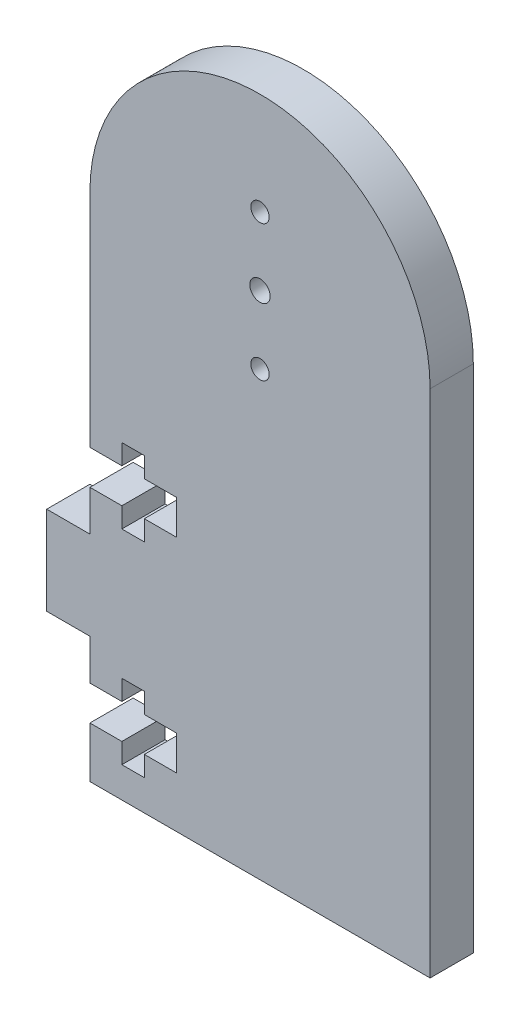
ISO-10303-21;
HEADER;
FILE_DESCRIPTION(('STEP AP214'),'2;1');
FILE_NAME('part.step','',(''),(''),'','','');
FILE_SCHEMA(('AUTOMOTIVE_DESIGN { 1 0 10303 214 1 1 1 1 }'));
ENDSEC;
DATA;
#1=APPLICATION_CONTEXT('core data for automotive mechanical design processes');
#2=APPLICATION_PROTOCOL_DEFINITION('international standard','automotive_design',2000,#1);
#3=PRODUCT_CONTEXT('',#1,'mechanical');
#4=PRODUCT('Part','Part','',(#3));
#5=PRODUCT_RELATED_PRODUCT_CATEGORY('part','',(#4));
#6=PRODUCT_DEFINITION_FORMATION('','',#4);
#7=PRODUCT_DEFINITION_CONTEXT('part definition',#1,'design');
#8=PRODUCT_DEFINITION('design','',#6,#7);
#9=PRODUCT_DEFINITION_SHAPE('','',#8);
#10=(LENGTH_UNIT() NAMED_UNIT(*) SI_UNIT(.MILLI.,.METRE.));
#11=(NAMED_UNIT(*) PLANE_ANGLE_UNIT() SI_UNIT($,.RADIAN.));
#12=(NAMED_UNIT(*) SI_UNIT($,.STERADIAN.) SOLID_ANGLE_UNIT());
#13=UNCERTAINTY_MEASURE_WITH_UNIT(LENGTH_MEASURE(1.E-05),#10,'distance_accuracy_value','');
#14=(GEOMETRIC_REPRESENTATION_CONTEXT(3) GLOBAL_UNCERTAINTY_ASSIGNED_CONTEXT((#13)) GLOBAL_UNIT_ASSIGNED_CONTEXT((#10,
#11,#12)) REPRESENTATION_CONTEXT('',''));
#15=CARTESIAN_POINT('',(0.,0.,0.));
#16=DIRECTION('',(0.,0.,1.));
#17=DIRECTION('',(1.,0.,0.));
#18=AXIS2_PLACEMENT_3D('',#15,#16,#17);
#19=CARTESIAN_POINT('',(-25.,0.,6.35));
#20=DIRECTION('',(1.,0.,0.));
#21=DIRECTION('',(0.,1.,0.));
#22=AXIS2_PLACEMENT_3D('',#19,#20,#21);
#23=PLANE('',#22);
#24=DIRECTION('',(0.,-1.,0.));
#25=VECTOR('',#24,1.);
#26=CARTESIAN_POINT('',(-25.,0.,0.));
#27=LINE('',#26,#25);
#28=CARTESIAN_POINT('',(-25.,-37.54,0.));
#29=VERTEX_POINT('',#28);
#30=CARTESIAN_POINT('',(-25.,-43.5,0.));
#31=VERTEX_POINT('',#30);
#32=EDGE_CURVE('E334',#29,#31,#27,.T.);
#33=ORIENTED_EDGE('',*,*,#32,.T.);
#34=DIRECTION('',(0.,0.,1.));
#35=VECTOR('',#34,1.);
#36=CARTESIAN_POINT('',(-25.,-43.5,0.));
#37=LINE('',#36,#35);
#38=CARTESIAN_POINT('',(-25.,-43.5,6.35));
#39=VERTEX_POINT('',#38);
#40=EDGE_CURVE('E60',#31,#39,#37,.T.);
#41=ORIENTED_EDGE('',*,*,#40,.T.);
#42=DIRECTION('',(0.,-1.,0.));
#43=VECTOR('',#42,1.);
#44=CARTESIAN_POINT('',(-25.,0.,6.35));
#45=LINE('',#44,#43);
#46=CARTESIAN_POINT('',(-25.,-37.54,6.35));
#47=VERTEX_POINT('',#46);
#48=EDGE_CURVE('E302',#47,#39,#45,.T.);
#49=ORIENTED_EDGE('',*,*,#48,.F.);
#50=DIRECTION('',(0.,0.,1.));
#51=VECTOR('',#50,1.);
#52=CARTESIAN_POINT('',(-25.,-37.54,0.));
#53=LINE('',#52,#51);
#54=EDGE_CURVE('E603',#29,#47,#53,.T.);
#55=ORIENTED_EDGE('',*,*,#54,.F.);
#56=EDGE_LOOP('',(#33,#41,#49,#55));
#57=FACE_BOUND('',#56,.T.);
#58=ADVANCED_FACE('F37',(#57),#23,.F.);
#59=CARTESIAN_POINT('',(-25.,-56.5,6.35));
#60=VERTEX_POINT('',#59);
#61=CARTESIAN_POINT('',(-25.,-62.46,6.35));
#62=VERTEX_POINT('',#61);
#63=EDGE_CURVE('E52',#60,#62,#45,.T.);
#64=ORIENTED_EDGE('',*,*,#63,.F.);
#65=DIRECTION('',(0.,0.,1.));
#66=VECTOR('',#65,1.);
#67=CARTESIAN_POINT('',(-25.,-56.5,0.));
#68=LINE('',#67,#66);
#69=CARTESIAN_POINT('',(-25.,-56.5,0.));
#70=VERTEX_POINT('',#69);
#71=EDGE_CURVE('E258',#70,#60,#68,.T.);
#72=ORIENTED_EDGE('',*,*,#71,.F.);
#73=CARTESIAN_POINT('',(-25.,-62.46,0.));
#74=VERTEX_POINT('',#73);
#75=EDGE_CURVE('E270',#70,#74,#27,.T.);
#76=ORIENTED_EDGE('',*,*,#75,.T.);
#77=DIRECTION('',(0.,0.,1.));
#78=VECTOR('',#77,1.);
#79=CARTESIAN_POINT('',(-25.,-62.46,0.));
#80=LINE('',#79,#78);
#81=EDGE_CURVE('E455',#74,#62,#80,.T.);
#82=ORIENTED_EDGE('',*,*,#81,.T.);
#83=EDGE_LOOP('',(#64,#72,#76,#82));
#84=FACE_BOUND('',#83,.T.);
#85=ADVANCED_FACE('F518',(#84),#23,.F.);
#86=CARTESIAN_POINT('',(-25.,-67.54,6.35));
#87=VERTEX_POINT('',#86);
#88=CARTESIAN_POINT('',(-25.,-75.,6.35));
#89=VERTEX_POINT('',#88);
#90=EDGE_CURVE('E303',#87,#89,#45,.T.);
#91=ORIENTED_EDGE('',*,*,#90,.F.);
#92=DIRECTION('',(0.,0.,1.));
#93=VECTOR('',#92,1.);
#94=CARTESIAN_POINT('',(-25.,-67.54,0.));
#95=LINE('',#94,#93);
#96=CARTESIAN_POINT('',(-25.,-67.54,0.));
#97=VERTEX_POINT('',#96);
#98=EDGE_CURVE('E453',#97,#87,#95,.T.);
#99=ORIENTED_EDGE('',*,*,#98,.F.);
#100=CARTESIAN_POINT('',(-25.,-75.,0.));
#101=VERTEX_POINT('',#100);
#102=EDGE_CURVE('E328',#97,#101,#27,.T.);
#103=ORIENTED_EDGE('',*,*,#102,.T.);
#104=DIRECTION('',(0.,0.,-1.));
#105=VECTOR('',#104,1.);
#106=CARTESIAN_POINT('',(-25.,-75.,6.35));
#107=LINE('',#106,#105);
#108=EDGE_CURVE('E45',#89,#101,#107,.T.);
#109=ORIENTED_EDGE('',*,*,#108,.F.);
#110=EDGE_LOOP('',(#91,#99,#103,#109));
#111=FACE_BOUND('',#110,.T.);
#112=ADVANCED_FACE('F523',(#111),#23,.F.);
#113=CARTESIAN_POINT('',(0.,0.,6.35));
#114=DIRECTION('',(0.,0.,-1.));
#115=DIRECTION('',(-1.,0.,0.));
#116=AXIS2_PLACEMENT_3D('',#113,#114,#115);
#117=CYLINDRICAL_SURFACE('',#116,25.);
#118=CARTESIAN_POINT('',(0.,0.,0.));
#119=DIRECTION('',(0.,0.,1.));
#120=DIRECTION('',(1.,0.,0.));
#121=AXIS2_PLACEMENT_3D('',#118,#119,#120);
#122=CIRCLE('',#121,25.);
#123=CARTESIAN_POINT('',(25.,0.,0.));
#124=VERTEX_POINT('',#123);
#125=CARTESIAN_POINT('',(-25.,0.,0.));
#126=VERTEX_POINT('',#125);
#127=EDGE_CURVE('E325',#124,#126,#122,.T.);
#128=ORIENTED_EDGE('',*,*,#127,.T.);
#129=DIRECTION('',(0.,0.,-1.));
#130=VECTOR('',#129,1.);
#131=CARTESIAN_POINT('',(-25.,0.,6.35));
#132=LINE('',#131,#130);
#133=CARTESIAN_POINT('',(-25.,0.,6.35));
#134=VERTEX_POINT('',#133);
#135=EDGE_CURVE('E12',#134,#126,#132,.T.);
#136=ORIENTED_EDGE('',*,*,#135,.F.);
#137=CARTESIAN_POINT('',(0.,0.,6.35));
#138=DIRECTION('',(0.,0.,1.));
#139=DIRECTION('',(1.,0.,0.));
#140=AXIS2_PLACEMENT_3D('',#137,#138,#139);
#141=CIRCLE('',#140,25.);
#142=CARTESIAN_POINT('',(25.,0.,6.35));
#143=VERTEX_POINT('',#142);
#144=EDGE_CURVE('E304',#143,#134,#141,.T.);
#145=ORIENTED_EDGE('',*,*,#144,.F.);
#146=DIRECTION('',(0.,0.,-1.));
#147=VECTOR('',#146,1.);
#148=CARTESIAN_POINT('',(25.,0.,6.35));
#149=LINE('',#148,#147);
#150=EDGE_CURVE('E324',#143,#124,#149,.T.);
#151=ORIENTED_EDGE('',*,*,#150,.T.);
#152=EDGE_LOOP('',(#128,#136,#145,#151));
#153=FACE_BOUND('',#152,.T.);
#154=ADVANCED_FACE('F39',(#153),#117,.T.);
#155=CARTESIAN_POINT('',(-25.,-32.46,0.));
#156=VERTEX_POINT('',#155);
#157=EDGE_CURVE('E330',#126,#156,#27,.T.);
#158=ORIENTED_EDGE('',*,*,#157,.T.);
#159=DIRECTION('',(0.,0.,1.));
#160=VECTOR('',#159,1.);
#161=CARTESIAN_POINT('',(-25.,-32.46,0.));
#162=LINE('',#161,#160);
#163=CARTESIAN_POINT('',(-25.,-32.46,6.35));
#164=VERTEX_POINT('',#163);
#165=EDGE_CURVE('E660',#156,#164,#162,.T.);
#166=ORIENTED_EDGE('',*,*,#165,.T.);
#167=EDGE_CURVE('E295',#134,#164,#45,.T.);
#168=ORIENTED_EDGE('',*,*,#167,.F.);
#169=ORIENTED_EDGE('',*,*,#135,.T.);
#170=EDGE_LOOP('',(#158,#166,#168,#169));
#171=FACE_BOUND('',#170,.T.);
#172=ADVANCED_FACE('F519',(#171),#23,.F.);
#173=CARTESIAN_POINT('',(-25.,-75.,6.35));
#174=DIRECTION('',(0.,1.,0.));
#175=DIRECTION('',(0.,0.,1.));
#176=AXIS2_PLACEMENT_3D('',#173,#174,#175);
#177=PLANE('',#176);
#178=DIRECTION('',(1.,0.,0.));
#179=VECTOR('',#178,1.);
#180=CARTESIAN_POINT('',(-25.,-75.,0.));
#181=LINE('',#180,#179);
#182=CARTESIAN_POINT('',(25.,-75.,0.));
#183=VERTEX_POINT('',#182);
#184=EDGE_CURVE('E333',#101,#183,#181,.T.);
#185=ORIENTED_EDGE('',*,*,#184,.T.);
#186=DIRECTION('',(0.,0.,-1.));
#187=VECTOR('',#186,1.);
#188=CARTESIAN_POINT('',(25.,-75.,6.35));
#189=LINE('',#188,#187);
#190=CARTESIAN_POINT('',(25.,-75.,6.35));
#191=VERTEX_POINT('',#190);
#192=EDGE_CURVE('E340',#191,#183,#189,.T.);
#193=ORIENTED_EDGE('',*,*,#192,.F.);
#194=DIRECTION('',(1.,0.,0.));
#195=VECTOR('',#194,1.);
#196=CARTESIAN_POINT('',(-25.,-75.,6.35));
#197=LINE('',#196,#195);
#198=EDGE_CURVE('E301',#89,#191,#197,.T.);
#199=ORIENTED_EDGE('',*,*,#198,.F.);
#200=ORIENTED_EDGE('',*,*,#108,.T.);
#201=EDGE_LOOP('',(#185,#193,#199,#200));
#202=FACE_BOUND('',#201,.T.);
#203=ADVANCED_FACE('F347',(#202),#177,.F.);
#204=CARTESIAN_POINT('',(25.,0.,6.35));
#205=DIRECTION('',(-1.,0.,0.));
#206=DIRECTION('',(0.,-1.,0.));
#207=AXIS2_PLACEMENT_3D('',#204,#205,#206);
#208=PLANE('',#207);
#209=DIRECTION('',(0.,1.,0.));
#210=VECTOR('',#209,1.);
#211=CARTESIAN_POINT('',(25.,0.,0.));
#212=LINE('',#211,#210);
#213=EDGE_CURVE('E336',#183,#124,#212,.T.);
#214=ORIENTED_EDGE('',*,*,#213,.T.);
#215=ORIENTED_EDGE('',*,*,#150,.F.);
#216=DIRECTION('',(0.,1.,0.));
#217=VECTOR('',#216,1.);
#218=CARTESIAN_POINT('',(25.,0.,6.35));
#219=LINE('',#218,#217);
#220=EDGE_CURVE('E320',#191,#143,#219,.T.);
#221=ORIENTED_EDGE('',*,*,#220,.F.);
#222=ORIENTED_EDGE('',*,*,#192,.T.);
#223=EDGE_LOOP('',(#214,#215,#221,#222));
#224=FACE_BOUND('',#223,.T.);
#225=ADVANCED_FACE('F357',(#224),#208,.F.);
#226=CARTESIAN_POINT('',(0.,0.,6.35));
#227=DIRECTION('',(0.,0.,1.));
#228=DIRECTION('',(1.,0.,0.));
#229=AXIS2_PLACEMENT_3D('',#226,#227,#228);
#230=PLANE('',#229);
#231=DIRECTION('',(1.,0.,0.));
#232=VECTOR('',#231,1.);
#233=CARTESIAN_POINT('',(-20.301,-37.54,6.35));
#234=LINE('',#233,#232);
#235=CARTESIAN_POINT('',(-20.301,-37.54,6.35));
#236=VERTEX_POINT('',#235);
#237=EDGE_CURVE('E378',#47,#236,#234,.T.);
#238=ORIENTED_EDGE('',*,*,#237,.F.);
#239=ORIENTED_EDGE('',*,*,#48,.T.);
#240=DIRECTION('',(-1.,0.,0.));
#241=VECTOR('',#240,1.);
#242=CARTESIAN_POINT('',(-31.35,-43.5,6.35));
#243=LINE('',#242,#241);
#244=CARTESIAN_POINT('',(-31.35,-43.5,6.35));
#245=VERTEX_POINT('',#244);
#246=EDGE_CURVE('E274',#39,#245,#243,.T.);
#247=ORIENTED_EDGE('',*,*,#246,.T.);
#248=DIRECTION('',(0.,-1.,0.));
#249=VECTOR('',#248,1.);
#250=CARTESIAN_POINT('',(-31.35,-43.5,6.35));
#251=LINE('',#250,#249);
#252=CARTESIAN_POINT('',(-31.35,-56.5,6.35));
#253=VERTEX_POINT('',#252);
#254=EDGE_CURVE('E281',#245,#253,#251,.T.);
#255=ORIENTED_EDGE('',*,*,#254,.T.);
#256=DIRECTION('',(1.,0.,0.));
#257=VECTOR('',#256,1.);
#258=CARTESIAN_POINT('',(-31.35,-56.5,6.35));
#259=LINE('',#258,#257);
#260=EDGE_CURVE('E253',#253,#60,#259,.T.);
#261=ORIENTED_EDGE('',*,*,#260,.T.);
#262=ORIENTED_EDGE('',*,*,#63,.T.);
#263=DIRECTION('',(-1.,0.,0.));
#264=VECTOR('',#263,1.);
#265=CARTESIAN_POINT('',(-20.301,-62.46,6.35));
#266=LINE('',#265,#264);
#267=CARTESIAN_POINT('',(-20.301,-62.46,6.35));
#268=VERTEX_POINT('',#267);
#269=EDGE_CURVE('E388',#268,#62,#266,.T.);
#270=ORIENTED_EDGE('',*,*,#269,.F.);
#271=DIRECTION('',(0.,-1.,0.));
#272=VECTOR('',#271,1.);
#273=CARTESIAN_POINT('',(-20.301,-62.46,6.35));
#274=LINE('',#273,#272);
#275=CARTESIAN_POINT('',(-20.301,-59.5009,6.35));
#276=VERTEX_POINT('',#275);
#277=EDGE_CURVE('E391',#276,#268,#274,.T.);
#278=ORIENTED_EDGE('',*,*,#277,.F.);
#279=DIRECTION('',(-1.,0.,0.));
#280=VECTOR('',#279,1.);
#281=CARTESIAN_POINT('',(-20.301,-59.5009,6.35));
#282=LINE('',#281,#280);
#283=CARTESIAN_POINT('',(-16.999,-59.5009,6.35));
#284=VERTEX_POINT('',#283);
#285=EDGE_CURVE('E394',#284,#276,#282,.T.);
#286=ORIENTED_EDGE('',*,*,#285,.F.);
#287=DIRECTION('',(0.,1.,0.));
#288=VECTOR('',#287,1.);
#289=CARTESIAN_POINT('',(-16.999,-62.46,6.35));
#290=LINE('',#289,#288);
#291=CARTESIAN_POINT('',(-16.999,-62.46,6.35));
#292=VERTEX_POINT('',#291);
#293=EDGE_CURVE('E398',#292,#284,#290,.T.);
#294=ORIENTED_EDGE('',*,*,#293,.F.);
#295=DIRECTION('',(-1.,0.,0.));
#296=VECTOR('',#295,1.);
#297=CARTESIAN_POINT('',(-12.3,-62.46,6.35));
#298=LINE('',#297,#296);
#299=CARTESIAN_POINT('',(-12.3,-62.46,6.35));
#300=VERTEX_POINT('',#299);
#301=EDGE_CURVE('E402',#300,#292,#298,.T.);
#302=ORIENTED_EDGE('',*,*,#301,.F.);
#303=DIRECTION('',(0.,1.,0.));
#304=VECTOR('',#303,1.);
#305=CARTESIAN_POINT('',(-12.3,-62.46,6.35));
#306=LINE('',#305,#304);
#307=CARTESIAN_POINT('',(-12.3,-67.54,6.35));
#308=VERTEX_POINT('',#307);
#309=EDGE_CURVE('E406',#308,#300,#306,.T.);
#310=ORIENTED_EDGE('',*,*,#309,.F.);
#311=DIRECTION('',(1.,0.,0.));
#312=VECTOR('',#311,1.);
#313=CARTESIAN_POINT('',(-12.3,-67.54,6.35));
#314=LINE('',#313,#312);
#315=CARTESIAN_POINT('',(-16.999,-67.54,6.35));
#316=VERTEX_POINT('',#315);
#317=EDGE_CURVE('E412',#316,#308,#314,.T.);
#318=ORIENTED_EDGE('',*,*,#317,.F.);
#319=DIRECTION('',(0.,1.,0.));
#320=VECTOR('',#319,1.);
#321=CARTESIAN_POINT('',(-16.999,-70.4991,6.35));
#322=LINE('',#321,#320);
#323=CARTESIAN_POINT('',(-16.999,-70.4991,6.35));
#324=VERTEX_POINT('',#323);
#325=EDGE_CURVE('E416',#324,#316,#322,.T.);
#326=ORIENTED_EDGE('',*,*,#325,.F.);
#327=DIRECTION('',(1.,0.,0.));
#328=VECTOR('',#327,1.);
#329=CARTESIAN_POINT('',(-20.301,-70.4991,6.35));
#330=LINE('',#329,#328);
#331=CARTESIAN_POINT('',(-20.301,-70.4991,6.35));
#332=VERTEX_POINT('',#331);
#333=EDGE_CURVE('E420',#332,#324,#330,.T.);
#334=ORIENTED_EDGE('',*,*,#333,.F.);
#335=DIRECTION('',(0.,-1.,0.));
#336=VECTOR('',#335,1.);
#337=CARTESIAN_POINT('',(-20.301,-70.4991,6.35));
#338=LINE('',#337,#336);
#339=CARTESIAN_POINT('',(-20.301,-67.54,6.35));
#340=VERTEX_POINT('',#339);
#341=EDGE_CURVE('E424',#340,#332,#338,.T.);
#342=ORIENTED_EDGE('',*,*,#341,.F.);
#343=DIRECTION('',(1.,0.,0.));
#344=VECTOR('',#343,1.);
#345=CARTESIAN_POINT('',(-20.301,-67.54,6.35));
#346=LINE('',#345,#344);
#347=EDGE_CURVE('E390',#87,#340,#346,.T.);
#348=ORIENTED_EDGE('',*,*,#347,.F.);
#349=ORIENTED_EDGE('',*,*,#90,.T.);
#350=ORIENTED_EDGE('',*,*,#198,.T.);
#351=ORIENTED_EDGE('',*,*,#220,.T.);
#352=ORIENTED_EDGE('',*,*,#144,.T.);
#353=ORIENTED_EDGE('',*,*,#167,.T.);
#354=DIRECTION('',(-1.,0.,0.));
#355=VECTOR('',#354,1.);
#356=CARTESIAN_POINT('',(-20.301,-32.46,6.35));
#357=LINE('',#356,#355);
#358=CARTESIAN_POINT('',(-20.301,-32.46,6.35));
#359=VERTEX_POINT('',#358);
#360=EDGE_CURVE('E705',#359,#164,#357,.T.);
#361=ORIENTED_EDGE('',*,*,#360,.F.);
#362=DIRECTION('',(0.,-1.,0.));
#363=VECTOR('',#362,1.);
#364=CARTESIAN_POINT('',(-20.301,-32.46,6.35));
#365=LINE('',#364,#363);
#366=CARTESIAN_POINT('',(-20.301,-29.5009,6.35));
#367=VERTEX_POINT('',#366);
#368=EDGE_CURVE('E693',#367,#359,#365,.T.);
#369=ORIENTED_EDGE('',*,*,#368,.F.);
#370=DIRECTION('',(-1.,0.,0.));
#371=VECTOR('',#370,1.);
#372=CARTESIAN_POINT('',(-20.301,-29.5009,6.35));
#373=LINE('',#372,#371);
#374=CARTESIAN_POINT('',(-16.999,-29.5009,6.35));
#375=VERTEX_POINT('',#374);
#376=EDGE_CURVE('E690',#375,#367,#373,.T.);
#377=ORIENTED_EDGE('',*,*,#376,.F.);
#378=DIRECTION('',(0.,1.,0.));
#379=VECTOR('',#378,1.);
#380=CARTESIAN_POINT('',(-16.999,-32.46,6.35));
#381=LINE('',#380,#379);
#382=CARTESIAN_POINT('',(-16.999,-32.46,6.35));
#383=VERTEX_POINT('',#382);
#384=EDGE_CURVE('E687',#383,#375,#381,.T.);
#385=ORIENTED_EDGE('',*,*,#384,.F.);
#386=DIRECTION('',(-1.,0.,0.));
#387=VECTOR('',#386,1.);
#388=CARTESIAN_POINT('',(-12.3,-32.46,6.35));
#389=LINE('',#388,#387);
#390=CARTESIAN_POINT('',(-12.3,-32.46,6.35));
#391=VERTEX_POINT('',#390);
#392=EDGE_CURVE('E631',#391,#383,#389,.T.);
#393=ORIENTED_EDGE('',*,*,#392,.F.);
#394=DIRECTION('',(0.,1.,0.));
#395=VECTOR('',#394,1.);
#396=CARTESIAN_POINT('',(-12.3,-32.46,6.35));
#397=LINE('',#396,#395);
#398=CARTESIAN_POINT('',(-12.3,-37.54,6.35));
#399=VERTEX_POINT('',#398);
#400=EDGE_CURVE('E382',#399,#391,#397,.T.);
#401=ORIENTED_EDGE('',*,*,#400,.F.);
#402=DIRECTION('',(1.,0.,0.));
#403=VECTOR('',#402,1.);
#404=CARTESIAN_POINT('',(-12.3,-37.54,6.35));
#405=LINE('',#404,#403);
#406=CARTESIAN_POINT('',(-16.999,-37.54,6.35));
#407=VERTEX_POINT('',#406);
#408=EDGE_CURVE('E641',#407,#399,#405,.T.);
#409=ORIENTED_EDGE('',*,*,#408,.F.);
#410=DIRECTION('',(0.,1.,0.));
#411=VECTOR('',#410,1.);
#412=CARTESIAN_POINT('',(-16.999,-40.4991,6.35));
#413=LINE('',#412,#411);
#414=CARTESIAN_POINT('',(-16.999,-40.4991,6.35));
#415=VERTEX_POINT('',#414);
#416=EDGE_CURVE('E647',#415,#407,#413,.T.);
#417=ORIENTED_EDGE('',*,*,#416,.F.);
#418=DIRECTION('',(1.,0.,0.));
#419=VECTOR('',#418,1.);
#420=CARTESIAN_POINT('',(-20.301,-40.4991,6.35));
#421=LINE('',#420,#419);
#422=CARTESIAN_POINT('',(-20.301,-40.4991,6.35));
#423=VERTEX_POINT('',#422);
#424=EDGE_CURVE('E714',#423,#415,#421,.T.);
#425=ORIENTED_EDGE('',*,*,#424,.F.);
#426=DIRECTION('',(0.,-1.,0.));
#427=VECTOR('',#426,1.);
#428=CARTESIAN_POINT('',(-20.301,-40.4991,6.35));
#429=LINE('',#428,#427);
#430=EDGE_CURVE('E710',#236,#423,#429,.T.);
#431=ORIENTED_EDGE('',*,*,#430,.F.);
#432=EDGE_LOOP('',(#238,#239,#247,#255,#261,#262,#270,#278,#286,#294,#302,#310,#318,#326,#334,
#342,#348,#349,#350,#351,#352,#353,#361,#369,#377,#385,#393,#401,#409,#417,#425,#431));
#433=FACE_BOUND('',#432,.T.);
#434=CARTESIAN_POINT('',(0.,-10.,6.35));
#435=DIRECTION('',(0.,0.,1.));
#436=DIRECTION('',(1.,0.,0.));
#437=AXIS2_PLACEMENT_3D('',#434,#435,#436);
#438=CIRCLE('',#437,1.35);
#439=CARTESIAN_POINT('',(1.35,-10.,6.35));
#440=VERTEX_POINT('',#439);
#441=EDGE_CURVE('E444',#440,#440,#438,.T.);
#442=ORIENTED_EDGE('',*,*,#441,.F.);
#443=EDGE_LOOP('',(#442));
#444=FACE_BOUND('',#443,.T.);
#445=CARTESIAN_POINT('',(0.,10.,6.35));
#446=DIRECTION('',(0.,0.,1.));
#447=DIRECTION('',(1.,0.,0.));
#448=AXIS2_PLACEMENT_3D('',#445,#446,#447);
#449=CIRCLE('',#448,1.35);
#450=CARTESIAN_POINT('',(1.35,10.,6.35));
#451=VERTEX_POINT('',#450);
#452=EDGE_CURVE('E471',#451,#451,#449,.T.);
#453=ORIENTED_EDGE('',*,*,#452,.F.);
#454=EDGE_LOOP('',(#453));
#455=FACE_BOUND('',#454,.T.);
#456=CARTESIAN_POINT('',(0.,0.,6.35));
#457=DIRECTION('',(0.,0.,1.));
#458=DIRECTION('',(1.,0.,0.));
#459=AXIS2_PLACEMENT_3D('',#456,#457,#458);
#460=CIRCLE('',#459,1.5);
#461=CARTESIAN_POINT('',(1.5,0.,6.35));
#462=VERTEX_POINT('',#461);
#463=EDGE_CURVE('E487',#462,#462,#460,.T.);
#464=ORIENTED_EDGE('',*,*,#463,.F.);
#465=EDGE_LOOP('',(#464));
#466=FACE_BOUND('',#465,.T.);
#467=ADVANCED_FACE('F374',(#433,#444,#455,#466),#230,.T.);
#468=CARTESIAN_POINT('',(0.,0.,0.));
#469=DIRECTION('',(0.,0.,1.));
#470=DIRECTION('',(1.,0.,0.));
#471=AXIS2_PLACEMENT_3D('',#468,#469,#470);
#472=PLANE('',#471);
#473=ORIENTED_EDGE('',*,*,#32,.F.);
#474=DIRECTION('',(1.,0.,0.));
#475=VECTOR('',#474,1.);
#476=CARTESIAN_POINT('',(-20.301,-37.54,0.));
#477=LINE('',#476,#475);
#478=CARTESIAN_POINT('',(-20.301,-37.54,0.));
#479=VERTEX_POINT('',#478);
#480=EDGE_CURVE('E606',#29,#479,#477,.T.);
#481=ORIENTED_EDGE('',*,*,#480,.T.);
#482=DIRECTION('',(0.,-1.,0.));
#483=VECTOR('',#482,1.);
#484=CARTESIAN_POINT('',(-20.301,-40.4991,0.));
#485=LINE('',#484,#483);
#486=CARTESIAN_POINT('',(-20.301,-40.4991,0.));
#487=VERTEX_POINT('',#486);
#488=EDGE_CURVE('E609',#479,#487,#485,.T.);
#489=ORIENTED_EDGE('',*,*,#488,.T.);
#490=DIRECTION('',(1.,0.,0.));
#491=VECTOR('',#490,1.);
#492=CARTESIAN_POINT('',(-20.301,-40.4991,0.));
#493=LINE('',#492,#491);
#494=CARTESIAN_POINT('',(-16.999,-40.4991,0.));
#495=VERTEX_POINT('',#494);
#496=EDGE_CURVE('E613',#487,#495,#493,.T.);
#497=ORIENTED_EDGE('',*,*,#496,.T.);
#498=DIRECTION('',(0.,1.,0.));
#499=VECTOR('',#498,1.);
#500=CARTESIAN_POINT('',(-16.999,-40.4991,0.));
#501=LINE('',#500,#499);
#502=CARTESIAN_POINT('',(-16.999,-37.54,0.));
#503=VERTEX_POINT('',#502);
#504=EDGE_CURVE('E621',#495,#503,#501,.T.);
#505=ORIENTED_EDGE('',*,*,#504,.T.);
#506=DIRECTION('',(1.,0.,0.));
#507=VECTOR('',#506,1.);
#508=CARTESIAN_POINT('',(-12.3,-37.54,0.));
#509=LINE('',#508,#507);
#510=CARTESIAN_POINT('',(-12.3,-37.54,0.));
#511=VERTEX_POINT('',#510);
#512=EDGE_CURVE('E624',#503,#511,#509,.T.);
#513=ORIENTED_EDGE('',*,*,#512,.T.);
#514=DIRECTION('',(0.,1.,0.));
#515=VECTOR('',#514,1.);
#516=CARTESIAN_POINT('',(-12.3,-32.46,0.));
#517=LINE('',#516,#515);
#518=CARTESIAN_POINT('',(-12.3,-32.46,0.));
#519=VERTEX_POINT('',#518);
#520=EDGE_CURVE('E646',#511,#519,#517,.T.);
#521=ORIENTED_EDGE('',*,*,#520,.T.);
#522=DIRECTION('',(-1.,0.,0.));
#523=VECTOR('',#522,1.);
#524=CARTESIAN_POINT('',(-12.3,-32.46,0.));
#525=LINE('',#524,#523);
#526=CARTESIAN_POINT('',(-16.999,-32.46,0.));
#527=VERTEX_POINT('',#526);
#528=EDGE_CURVE('E679',#519,#527,#525,.T.);
#529=ORIENTED_EDGE('',*,*,#528,.T.);
#530=DIRECTION('',(0.,1.,0.));
#531=VECTOR('',#530,1.);
#532=CARTESIAN_POINT('',(-16.999,-32.46,0.));
#533=LINE('',#532,#531);
#534=CARTESIAN_POINT('',(-16.999,-29.5009,0.));
#535=VERTEX_POINT('',#534);
#536=EDGE_CURVE('E1040',#527,#535,#533,.T.);
#537=ORIENTED_EDGE('',*,*,#536,.T.);
#538=DIRECTION('',(-1.,0.,0.));
#539=VECTOR('',#538,1.);
#540=CARTESIAN_POINT('',(-20.301,-29.5009,0.));
#541=LINE('',#540,#539);
#542=CARTESIAN_POINT('',(-20.301,-29.5009,0.));
#543=VERTEX_POINT('',#542);
#544=EDGE_CURVE('E1038',#535,#543,#541,.T.);
#545=ORIENTED_EDGE('',*,*,#544,.T.);
#546=DIRECTION('',(0.,-1.,0.));
#547=VECTOR('',#546,1.);
#548=CARTESIAN_POINT('',(-20.301,-32.46,0.));
#549=LINE('',#548,#547);
#550=CARTESIAN_POINT('',(-20.301,-32.46,0.));
#551=VERTEX_POINT('',#550);
#552=EDGE_CURVE('E616',#543,#551,#549,.T.);
#553=ORIENTED_EDGE('',*,*,#552,.T.);
#554=DIRECTION('',(-1.,0.,0.));
#555=VECTOR('',#554,1.);
#556=CARTESIAN_POINT('',(-20.301,-32.46,0.));
#557=LINE('',#556,#555);
#558=EDGE_CURVE('E611',#551,#156,#557,.T.);
#559=ORIENTED_EDGE('',*,*,#558,.T.);
#560=ORIENTED_EDGE('',*,*,#157,.F.);
#561=ORIENTED_EDGE('',*,*,#127,.F.);
#562=ORIENTED_EDGE('',*,*,#213,.F.);
#563=ORIENTED_EDGE('',*,*,#184,.F.);
#564=ORIENTED_EDGE('',*,*,#102,.F.);
#565=DIRECTION('',(1.,0.,0.));
#566=VECTOR('',#565,1.);
#567=CARTESIAN_POINT('',(-20.301,-67.54,0.));
#568=LINE('',#567,#566);
#569=CARTESIAN_POINT('',(-20.301,-67.54,0.));
#570=VERTEX_POINT('',#569);
#571=EDGE_CURVE('E538',#97,#570,#568,.T.);
#572=ORIENTED_EDGE('',*,*,#571,.T.);
#573=DIRECTION('',(0.,-1.,0.));
#574=VECTOR('',#573,1.);
#575=CARTESIAN_POINT('',(-20.301,-70.4991,0.));
#576=LINE('',#575,#574);
#577=CARTESIAN_POINT('',(-20.301,-70.4991,0.));
#578=VERTEX_POINT('',#577);
#579=EDGE_CURVE('E546',#570,#578,#576,.T.);
#580=ORIENTED_EDGE('',*,*,#579,.T.);
#581=DIRECTION('',(1.,0.,0.));
#582=VECTOR('',#581,1.);
#583=CARTESIAN_POINT('',(-20.301,-70.4991,0.));
#584=LINE('',#583,#582);
#585=CARTESIAN_POINT('',(-16.999,-70.4991,0.));
#586=VERTEX_POINT('',#585);
#587=EDGE_CURVE('E548',#578,#586,#584,.T.);
#588=ORIENTED_EDGE('',*,*,#587,.T.);
#589=DIRECTION('',(0.,1.,0.));
#590=VECTOR('',#589,1.);
#591=CARTESIAN_POINT('',(-16.999,-70.4991,0.));
#592=LINE('',#591,#590);
#593=CARTESIAN_POINT('',(-16.999,-67.54,0.));
#594=VERTEX_POINT('',#593);
#595=EDGE_CURVE('E557',#586,#594,#592,.T.);
#596=ORIENTED_EDGE('',*,*,#595,.T.);
#597=DIRECTION('',(1.,0.,0.));
#598=VECTOR('',#597,1.);
#599=CARTESIAN_POINT('',(-12.3,-67.54,0.));
#600=LINE('',#599,#598);
#601=CARTESIAN_POINT('',(-12.3,-67.54,0.));
#602=VERTEX_POINT('',#601);
#603=EDGE_CURVE('E467',#594,#602,#600,.T.);
#604=ORIENTED_EDGE('',*,*,#603,.T.);
#605=DIRECTION('',(0.,1.,0.));
#606=VECTOR('',#605,1.);
#607=CARTESIAN_POINT('',(-12.3,-62.46,0.));
#608=LINE('',#607,#606);
#609=CARTESIAN_POINT('',(-12.3,-62.46,0.));
#610=VERTEX_POINT('',#609);
#611=EDGE_CURVE('E415',#602,#610,#608,.T.);
#612=ORIENTED_EDGE('',*,*,#611,.T.);
#613=DIRECTION('',(-1.,0.,0.));
#614=VECTOR('',#613,1.);
#615=CARTESIAN_POINT('',(-12.3,-62.46,0.));
#616=LINE('',#615,#614);
#617=CARTESIAN_POINT('',(-16.999,-62.46,0.));
#618=VERTEX_POINT('',#617);
#619=EDGE_CURVE('E581',#610,#618,#616,.T.);
#620=ORIENTED_EDGE('',*,*,#619,.T.);
#621=DIRECTION('',(0.,1.,0.));
#622=VECTOR('',#621,1.);
#623=CARTESIAN_POINT('',(-16.999,-62.46,0.));
#624=LINE('',#623,#622);
#625=CARTESIAN_POINT('',(-16.999,-59.5009,0.));
#626=VERTEX_POINT('',#625);
#627=EDGE_CURVE('E583',#618,#626,#624,.T.);
#628=ORIENTED_EDGE('',*,*,#627,.T.);
#629=DIRECTION('',(-1.,0.,0.));
#630=VECTOR('',#629,1.);
#631=CARTESIAN_POINT('',(-20.301,-59.5009,0.));
#632=LINE('',#631,#630);
#633=CARTESIAN_POINT('',(-20.301,-59.5009,0.));
#634=VERTEX_POINT('',#633);
#635=EDGE_CURVE('E591',#626,#634,#632,.T.);
#636=ORIENTED_EDGE('',*,*,#635,.T.);
#637=DIRECTION('',(0.,-1.,0.));
#638=VECTOR('',#637,1.);
#639=CARTESIAN_POINT('',(-20.301,-62.46,0.));
#640=LINE('',#639,#638);
#641=CARTESIAN_POINT('',(-20.301,-62.46,0.));
#642=VERTEX_POINT('',#641);
#643=EDGE_CURVE('E552',#634,#642,#640,.T.);
#644=ORIENTED_EDGE('',*,*,#643,.T.);
#645=DIRECTION('',(-1.,0.,0.));
#646=VECTOR('',#645,1.);
#647=CARTESIAN_POINT('',(-20.301,-62.46,0.));
#648=LINE('',#647,#646);
#649=EDGE_CURVE('E550',#642,#74,#648,.T.);
#650=ORIENTED_EDGE('',*,*,#649,.T.);
#651=ORIENTED_EDGE('',*,*,#75,.F.);
#652=DIRECTION('',(1.,0.,0.));
#653=VECTOR('',#652,1.);
#654=CARTESIAN_POINT('',(-31.35,-56.5,0.));
#655=LINE('',#654,#653);
#656=CARTESIAN_POINT('',(-31.35,-56.5,0.));
#657=VERTEX_POINT('',#656);
#658=EDGE_CURVE('E251',#657,#70,#655,.T.);
#659=ORIENTED_EDGE('',*,*,#658,.F.);
#660=DIRECTION('',(0.,-1.,0.));
#661=VECTOR('',#660,1.);
#662=CARTESIAN_POINT('',(-31.35,-43.5,0.));
#663=LINE('',#662,#661);
#664=CARTESIAN_POINT('',(-31.35,-43.5,0.));
#665=VERTEX_POINT('',#664);
#666=EDGE_CURVE('E267',#665,#657,#663,.T.);
#667=ORIENTED_EDGE('',*,*,#666,.F.);
#668=DIRECTION('',(-1.,0.,0.));
#669=VECTOR('',#668,1.);
#670=CARTESIAN_POINT('',(-31.35,-43.5,0.));
#671=LINE('',#670,#669);
#672=EDGE_CURVE('E259',#31,#665,#671,.T.);
#673=ORIENTED_EDGE('',*,*,#672,.F.);
#674=EDGE_LOOP('',(#473,#481,#489,#497,#505,#513,#521,#529,#537,#545,#553,#559,#560,#561,#562,
#563,#564,#572,#580,#588,#596,#604,#612,#620,#628,#636,#644,#650,#651,#659,#667,#673));
#675=FACE_BOUND('',#674,.T.);
#676=CARTESIAN_POINT('',(0.,-10.,0.));
#677=DIRECTION('',(0.,0.,1.));
#678=DIRECTION('',(1.,0.,0.));
#679=AXIS2_PLACEMENT_3D('',#676,#677,#678);
#680=CIRCLE('',#679,1.35);
#681=CARTESIAN_POINT('',(1.35,-10.,0.));
#682=VERTEX_POINT('',#681);
#683=EDGE_CURVE('E468',#682,#682,#680,.T.);
#684=ORIENTED_EDGE('',*,*,#683,.T.);
#685=EDGE_LOOP('',(#684));
#686=FACE_BOUND('',#685,.T.);
#687=CARTESIAN_POINT('',(0.,10.,0.));
#688=DIRECTION('',(0.,0.,1.));
#689=DIRECTION('',(1.,0.,0.));
#690=AXIS2_PLACEMENT_3D('',#687,#688,#689);
#691=CIRCLE('',#690,1.35);
#692=CARTESIAN_POINT('',(1.35,10.,0.));
#693=VERTEX_POINT('',#692);
#694=EDGE_CURVE('E476',#693,#693,#691,.T.);
#695=ORIENTED_EDGE('',*,*,#694,.T.);
#696=EDGE_LOOP('',(#695));
#697=FACE_BOUND('',#696,.T.);
#698=CARTESIAN_POINT('',(0.,0.,0.));
#699=DIRECTION('',(0.,0.,1.));
#700=DIRECTION('',(1.,0.,0.));
#701=AXIS2_PLACEMENT_3D('',#698,#699,#700);
#702=CIRCLE('',#701,1.5);
#703=CARTESIAN_POINT('',(1.5,0.,0.));
#704=VERTEX_POINT('',#703);
#705=EDGE_CURVE('E329',#704,#704,#702,.T.);
#706=ORIENTED_EDGE('',*,*,#705,.T.);
#707=EDGE_LOOP('',(#706));
#708=FACE_BOUND('',#707,.T.);
#709=ADVANCED_FACE('F264',(#675,#686,#697,#708),#472,.F.);
#710=CARTESIAN_POINT('',(0.,0.,0.));
#711=DIRECTION('',(0.,0.,1.));
#712=DIRECTION('',(1.,0.,0.));
#713=AXIS2_PLACEMENT_3D('',#710,#711,#712);
#714=CYLINDRICAL_SURFACE('',#713,1.5);
#715=ORIENTED_EDGE('',*,*,#705,.F.);
#716=EDGE_LOOP('',(#715));
#717=FACE_BOUND('',#716,.T.);
#718=ORIENTED_EDGE('',*,*,#463,.T.);
#719=EDGE_LOOP('',(#718));
#720=FACE_BOUND('',#719,.T.);
#721=ADVANCED_FACE('F502',(#717,#720),#714,.F.);
#722=CARTESIAN_POINT('',(0.,10.,0.));
#723=DIRECTION('',(0.,0.,1.));
#724=DIRECTION('',(1.,0.,0.));
#725=AXIS2_PLACEMENT_3D('',#722,#723,#724);
#726=CYLINDRICAL_SURFACE('',#725,1.35);
#727=ORIENTED_EDGE('',*,*,#694,.F.);
#728=EDGE_LOOP('',(#727));
#729=FACE_BOUND('',#728,.T.);
#730=ORIENTED_EDGE('',*,*,#452,.T.);
#731=EDGE_LOOP('',(#730));
#732=FACE_BOUND('',#731,.T.);
#733=ADVANCED_FACE('F498',(#729,#732),#726,.F.);
#734=CARTESIAN_POINT('',(0.,-10.,0.));
#735=DIRECTION('',(0.,0.,1.));
#736=DIRECTION('',(1.,0.,0.));
#737=AXIS2_PLACEMENT_3D('',#734,#735,#736);
#738=CYLINDRICAL_SURFACE('',#737,1.35);
#739=ORIENTED_EDGE('',*,*,#683,.F.);
#740=EDGE_LOOP('',(#739));
#741=FACE_BOUND('',#740,.T.);
#742=ORIENTED_EDGE('',*,*,#441,.T.);
#743=EDGE_LOOP('',(#742));
#744=FACE_BOUND('',#743,.T.);
#745=ADVANCED_FACE('F501',(#741,#744),#738,.F.);
#746=CARTESIAN_POINT('',(-12.3,-62.46,0.));
#747=DIRECTION('',(1.,0.,0.));
#748=DIRECTION('',(0.,0.,-1.));
#749=AXIS2_PLACEMENT_3D('',#746,#747,#748);
#750=PLANE('',#749);
#751=ORIENTED_EDGE('',*,*,#309,.T.);
#752=DIRECTION('',(0.,0.,1.));
#753=VECTOR('',#752,1.);
#754=CARTESIAN_POINT('',(-12.3,-62.46,0.));
#755=LINE('',#754,#753);
#756=EDGE_CURVE('E465',#610,#300,#755,.T.);
#757=ORIENTED_EDGE('',*,*,#756,.F.);
#758=ORIENTED_EDGE('',*,*,#611,.F.);
#759=DIRECTION('',(0.,0.,1.));
#760=VECTOR('',#759,1.);
#761=CARTESIAN_POINT('',(-12.3,-67.54,0.));
#762=LINE('',#761,#760);
#763=EDGE_CURVE('E442',#602,#308,#762,.T.);
#764=ORIENTED_EDGE('',*,*,#763,.T.);
#765=EDGE_LOOP('',(#751,#757,#758,#764));
#766=FACE_BOUND('',#765,.T.);
#767=ADVANCED_FACE('F579',(#766),#750,.F.);
#768=CARTESIAN_POINT('',(-12.3,-67.54,0.));
#769=DIRECTION('',(0.,-1.,0.));
#770=DIRECTION('',(0.,0.,-1.));
#771=AXIS2_PLACEMENT_3D('',#768,#769,#770);
#772=PLANE('',#771);
#773=ORIENTED_EDGE('',*,*,#317,.T.);
#774=ORIENTED_EDGE('',*,*,#763,.F.);
#775=ORIENTED_EDGE('',*,*,#603,.F.);
#776=DIRECTION('',(0.,0.,1.));
#777=VECTOR('',#776,1.);
#778=CARTESIAN_POINT('',(-16.999,-67.54,0.));
#779=LINE('',#778,#777);
#780=EDGE_CURVE('E445',#594,#316,#779,.T.);
#781=ORIENTED_EDGE('',*,*,#780,.T.);
#782=EDGE_LOOP('',(#773,#774,#775,#781));
#783=FACE_BOUND('',#782,.T.);
#784=ADVANCED_FACE('F575',(#783),#772,.F.);
#785=CARTESIAN_POINT('',(-16.999,-70.4991,0.));
#786=DIRECTION('',(1.,0.,0.));
#787=DIRECTION('',(0.,0.,-1.));
#788=AXIS2_PLACEMENT_3D('',#785,#786,#787);
#789=PLANE('',#788);
#790=ORIENTED_EDGE('',*,*,#325,.T.);
#791=ORIENTED_EDGE('',*,*,#780,.F.);
#792=ORIENTED_EDGE('',*,*,#595,.F.);
#793=DIRECTION('',(0.,0.,1.));
#794=VECTOR('',#793,1.);
#795=CARTESIAN_POINT('',(-16.999,-70.4991,0.));
#796=LINE('',#795,#794);
#797=EDGE_CURVE('E447',#586,#324,#796,.T.);
#798=ORIENTED_EDGE('',*,*,#797,.T.);
#799=EDGE_LOOP('',(#790,#791,#792,#798));
#800=FACE_BOUND('',#799,.T.);
#801=ADVANCED_FACE('F764',(#800),#789,.F.);
#802=CARTESIAN_POINT('',(-20.301,-70.4991,0.));
#803=DIRECTION('',(0.,-1.,0.));
#804=DIRECTION('',(0.,0.,-1.));
#805=AXIS2_PLACEMENT_3D('',#802,#803,#804);
#806=PLANE('',#805);
#807=ORIENTED_EDGE('',*,*,#333,.T.);
#808=ORIENTED_EDGE('',*,*,#797,.F.);
#809=ORIENTED_EDGE('',*,*,#587,.F.);
#810=DIRECTION('',(0.,0.,1.));
#811=VECTOR('',#810,1.);
#812=CARTESIAN_POINT('',(-20.301,-70.4991,0.));
#813=LINE('',#812,#811);
#814=EDGE_CURVE('E449',#578,#332,#813,.T.);
#815=ORIENTED_EDGE('',*,*,#814,.T.);
#816=EDGE_LOOP('',(#807,#808,#809,#815));
#817=FACE_BOUND('',#816,.T.);
#818=ADVANCED_FACE('F767',(#817),#806,.F.);
#819=CARTESIAN_POINT('',(-20.301,-70.4991,0.));
#820=DIRECTION('',(-1.,0.,0.));
#821=DIRECTION('',(0.,-1.,0.));
#822=AXIS2_PLACEMENT_3D('',#819,#820,#821);
#823=PLANE('',#822);
#824=ORIENTED_EDGE('',*,*,#341,.T.);
#825=ORIENTED_EDGE('',*,*,#814,.F.);
#826=ORIENTED_EDGE('',*,*,#579,.F.);
#827=DIRECTION('',(0.,0.,1.));
#828=VECTOR('',#827,1.);
#829=CARTESIAN_POINT('',(-20.301,-67.54,0.));
#830=LINE('',#829,#828);
#831=EDGE_CURVE('E451',#570,#340,#830,.T.);
#832=ORIENTED_EDGE('',*,*,#831,.T.);
#833=EDGE_LOOP('',(#824,#825,#826,#832));
#834=FACE_BOUND('',#833,.T.);
#835=ADVANCED_FACE('F542',(#834),#823,.F.);
#836=CARTESIAN_POINT('',(-20.301,-67.54,0.));
#837=DIRECTION('',(0.,-1.,0.));
#838=DIRECTION('',(1.,0.,0.));
#839=AXIS2_PLACEMENT_3D('',#836,#837,#838);
#840=PLANE('',#839);
#841=ORIENTED_EDGE('',*,*,#347,.T.);
#842=ORIENTED_EDGE('',*,*,#831,.F.);
#843=ORIENTED_EDGE('',*,*,#571,.F.);
#844=ORIENTED_EDGE('',*,*,#98,.T.);
#845=EDGE_LOOP('',(#841,#842,#843,#844));
#846=FACE_BOUND('',#845,.T.);
#847=ADVANCED_FACE('F537',(#846),#840,.F.);
#848=CARTESIAN_POINT('',(-20.301,-62.46,0.));
#849=DIRECTION('',(0.,1.,0.));
#850=DIRECTION('',(0.,0.,1.));
#851=AXIS2_PLACEMENT_3D('',#848,#849,#850);
#852=PLANE('',#851);
#853=ORIENTED_EDGE('',*,*,#269,.T.);
#854=ORIENTED_EDGE('',*,*,#81,.F.);
#855=ORIENTED_EDGE('',*,*,#649,.F.);
#856=DIRECTION('',(0.,0.,1.));
#857=VECTOR('',#856,1.);
#858=CARTESIAN_POINT('',(-20.301,-62.46,0.));
#859=LINE('',#858,#857);
#860=EDGE_CURVE('E457',#642,#268,#859,.T.);
#861=ORIENTED_EDGE('',*,*,#860,.T.);
#862=EDGE_LOOP('',(#853,#854,#855,#861));
#863=FACE_BOUND('',#862,.T.);
#864=ADVANCED_FACE('F602',(#863),#852,.F.);
#865=CARTESIAN_POINT('',(-20.301,-62.46,0.));
#866=DIRECTION('',(-1.,0.,0.));
#867=DIRECTION('',(0.,0.,1.));
#868=AXIS2_PLACEMENT_3D('',#865,#866,#867);
#869=PLANE('',#868);
#870=ORIENTED_EDGE('',*,*,#277,.T.);
#871=ORIENTED_EDGE('',*,*,#860,.F.);
#872=ORIENTED_EDGE('',*,*,#643,.F.);
#873=DIRECTION('',(0.,0.,1.));
#874=VECTOR('',#873,1.);
#875=CARTESIAN_POINT('',(-20.301,-59.5009,0.));
#876=LINE('',#875,#874);
#877=EDGE_CURVE('E459',#634,#276,#876,.T.);
#878=ORIENTED_EDGE('',*,*,#877,.T.);
#879=EDGE_LOOP('',(#870,#871,#872,#878));
#880=FACE_BOUND('',#879,.T.);
#881=ADVANCED_FACE('F598',(#880),#869,.F.);
#882=CARTESIAN_POINT('',(-20.301,-59.5009,0.));
#883=DIRECTION('',(0.,1.,0.));
#884=DIRECTION('',(0.,0.,1.));
#885=AXIS2_PLACEMENT_3D('',#882,#883,#884);
#886=PLANE('',#885);
#887=ORIENTED_EDGE('',*,*,#285,.T.);
#888=ORIENTED_EDGE('',*,*,#877,.F.);
#889=ORIENTED_EDGE('',*,*,#635,.F.);
#890=DIRECTION('',(0.,0.,1.));
#891=VECTOR('',#890,1.);
#892=CARTESIAN_POINT('',(-16.999,-59.5009,0.));
#893=LINE('',#892,#891);
#894=EDGE_CURVE('E461',#626,#284,#893,.T.);
#895=ORIENTED_EDGE('',*,*,#894,.T.);
#896=EDGE_LOOP('',(#887,#888,#889,#895));
#897=FACE_BOUND('',#896,.T.);
#898=ADVANCED_FACE('F780',(#897),#886,.F.);
#899=CARTESIAN_POINT('',(-16.999,-62.46,0.));
#900=DIRECTION('',(1.,0.,0.));
#901=DIRECTION('',(0.,0.,-1.));
#902=AXIS2_PLACEMENT_3D('',#899,#900,#901);
#903=PLANE('',#902);
#904=ORIENTED_EDGE('',*,*,#293,.T.);
#905=ORIENTED_EDGE('',*,*,#894,.F.);
#906=ORIENTED_EDGE('',*,*,#627,.F.);
#907=DIRECTION('',(0.,0.,1.));
#908=VECTOR('',#907,1.);
#909=CARTESIAN_POINT('',(-16.999,-62.46,0.));
#910=LINE('',#909,#908);
#911=EDGE_CURVE('E463',#618,#292,#910,.T.);
#912=ORIENTED_EDGE('',*,*,#911,.T.);
#913=EDGE_LOOP('',(#904,#905,#906,#912));
#914=FACE_BOUND('',#913,.T.);
#915=ADVANCED_FACE('F783',(#914),#903,.F.);
#916=CARTESIAN_POINT('',(-12.3,-62.46,0.));
#917=DIRECTION('',(0.,1.,0.));
#918=DIRECTION('',(0.,0.,1.));
#919=AXIS2_PLACEMENT_3D('',#916,#917,#918);
#920=PLANE('',#919);
#921=ORIENTED_EDGE('',*,*,#301,.T.);
#922=ORIENTED_EDGE('',*,*,#911,.F.);
#923=ORIENTED_EDGE('',*,*,#619,.F.);
#924=ORIENTED_EDGE('',*,*,#756,.T.);
#925=EDGE_LOOP('',(#921,#922,#923,#924));
#926=FACE_BOUND('',#925,.T.);
#927=ADVANCED_FACE('F761',(#926),#920,.F.);
#928=CARTESIAN_POINT('',(-12.3,-32.46,0.));
#929=DIRECTION('',(1.,0.,0.));
#930=DIRECTION('',(0.,0.,-1.));
#931=AXIS2_PLACEMENT_3D('',#928,#929,#930);
#932=PLANE('',#931);
#933=ORIENTED_EDGE('',*,*,#400,.T.);
#934=DIRECTION('',(0.,0.,1.));
#935=VECTOR('',#934,1.);
#936=CARTESIAN_POINT('',(-12.3,-32.46,0.));
#937=LINE('',#936,#935);
#938=EDGE_CURVE('E586',#519,#391,#937,.T.);
#939=ORIENTED_EDGE('',*,*,#938,.F.);
#940=ORIENTED_EDGE('',*,*,#520,.F.);
#941=DIRECTION('',(0.,0.,1.));
#942=VECTOR('',#941,1.);
#943=CARTESIAN_POINT('',(-12.3,-37.54,0.));
#944=LINE('',#943,#942);
#945=EDGE_CURVE('E410',#511,#399,#944,.T.);
#946=ORIENTED_EDGE('',*,*,#945,.T.);
#947=EDGE_LOOP('',(#933,#939,#940,#946));
#948=FACE_BOUND('',#947,.T.);
#949=ADVANCED_FACE('F684',(#948),#932,.F.);
#950=CARTESIAN_POINT('',(-12.3,-37.54,0.));
#951=DIRECTION('',(0.,-1.,0.));
#952=DIRECTION('',(0.,0.,-1.));
#953=AXIS2_PLACEMENT_3D('',#950,#951,#952);
#954=PLANE('',#953);
#955=ORIENTED_EDGE('',*,*,#408,.T.);
#956=ORIENTED_EDGE('',*,*,#945,.F.);
#957=ORIENTED_EDGE('',*,*,#512,.F.);
#958=DIRECTION('',(0.,0.,1.));
#959=VECTOR('',#958,1.);
#960=CARTESIAN_POINT('',(-16.999,-37.54,0.));
#961=LINE('',#960,#959);
#962=EDGE_CURVE('E651',#503,#407,#961,.T.);
#963=ORIENTED_EDGE('',*,*,#962,.T.);
#964=EDGE_LOOP('',(#955,#956,#957,#963));
#965=FACE_BOUND('',#964,.T.);
#966=ADVANCED_FACE('F728',(#965),#954,.F.);
#967=CARTESIAN_POINT('',(-16.999,-40.4991,0.));
#968=DIRECTION('',(1.,0.,0.));
#969=DIRECTION('',(0.,0.,-1.));
#970=AXIS2_PLACEMENT_3D('',#967,#968,#969);
#971=PLANE('',#970);
#972=ORIENTED_EDGE('',*,*,#416,.T.);
#973=ORIENTED_EDGE('',*,*,#962,.F.);
#974=ORIENTED_EDGE('',*,*,#504,.F.);
#975=DIRECTION('',(0.,0.,1.));
#976=VECTOR('',#975,1.);
#977=CARTESIAN_POINT('',(-16.999,-40.4991,0.));
#978=LINE('',#977,#976);
#979=EDGE_CURVE('E653',#495,#415,#978,.T.);
#980=ORIENTED_EDGE('',*,*,#979,.T.);
#981=EDGE_LOOP('',(#972,#973,#974,#980));
#982=FACE_BOUND('',#981,.T.);
#983=ADVANCED_FACE('F724',(#982),#971,.F.);
#984=CARTESIAN_POINT('',(-20.301,-40.4991,0.));
#985=DIRECTION('',(0.,-1.,0.));
#986=DIRECTION('',(0.,0.,-1.));
#987=AXIS2_PLACEMENT_3D('',#984,#985,#986);
#988=PLANE('',#987);
#989=ORIENTED_EDGE('',*,*,#424,.T.);
#990=ORIENTED_EDGE('',*,*,#979,.F.);
#991=ORIENTED_EDGE('',*,*,#496,.F.);
#992=DIRECTION('',(0.,0.,1.));
#993=VECTOR('',#992,1.);
#994=CARTESIAN_POINT('',(-20.301,-40.4991,0.));
#995=LINE('',#994,#993);
#996=EDGE_CURVE('E655',#487,#423,#995,.T.);
#997=ORIENTED_EDGE('',*,*,#996,.T.);
#998=EDGE_LOOP('',(#989,#990,#991,#997));
#999=FACE_BOUND('',#998,.T.);
#1000=ADVANCED_FACE('F730',(#999),#988,.F.);
#1001=CARTESIAN_POINT('',(-20.301,-40.4991,0.));
#1002=DIRECTION('',(-1.,0.,0.));
#1003=DIRECTION('',(0.,-1.,0.));
#1004=AXIS2_PLACEMENT_3D('',#1001,#1002,#1003);
#1005=PLANE('',#1004);
#1006=ORIENTED_EDGE('',*,*,#430,.T.);
#1007=ORIENTED_EDGE('',*,*,#996,.F.);
#1008=ORIENTED_EDGE('',*,*,#488,.F.);
#1009=DIRECTION('',(0.,0.,1.));
#1010=VECTOR('',#1009,1.);
#1011=CARTESIAN_POINT('',(-20.301,-37.54,0.));
#1012=LINE('',#1011,#1010);
#1013=EDGE_CURVE('E657',#479,#236,#1012,.T.);
#1014=ORIENTED_EDGE('',*,*,#1013,.T.);
#1015=EDGE_LOOP('',(#1006,#1007,#1008,#1014));
#1016=FACE_BOUND('',#1015,.T.);
#1017=ADVANCED_FACE('F732',(#1016),#1005,.F.);
#1018=CARTESIAN_POINT('',(-20.301,-37.54,0.));
#1019=DIRECTION('',(0.,-1.,0.));
#1020=DIRECTION('',(1.,0.,0.));
#1021=AXIS2_PLACEMENT_3D('',#1018,#1019,#1020);
#1022=PLANE('',#1021);
#1023=ORIENTED_EDGE('',*,*,#237,.T.);
#1024=ORIENTED_EDGE('',*,*,#1013,.F.);
#1025=ORIENTED_EDGE('',*,*,#480,.F.);
#1026=ORIENTED_EDGE('',*,*,#54,.T.);
#1027=EDGE_LOOP('',(#1023,#1024,#1025,#1026));
#1028=FACE_BOUND('',#1027,.T.);
#1029=ADVANCED_FACE('F733',(#1028),#1022,.F.);
#1030=CARTESIAN_POINT('',(-20.301,-32.46,0.));
#1031=DIRECTION('',(0.,1.,0.));
#1032=DIRECTION('',(0.,0.,1.));
#1033=AXIS2_PLACEMENT_3D('',#1030,#1031,#1032);
#1034=PLANE('',#1033);
#1035=ORIENTED_EDGE('',*,*,#360,.T.);
#1036=ORIENTED_EDGE('',*,*,#165,.F.);
#1037=ORIENTED_EDGE('',*,*,#558,.F.);
#1038=DIRECTION('',(0.,0.,1.));
#1039=VECTOR('',#1038,1.);
#1040=CARTESIAN_POINT('',(-20.301,-32.46,0.));
#1041=LINE('',#1040,#1039);
#1042=EDGE_CURVE('E663',#551,#359,#1041,.T.);
#1043=ORIENTED_EDGE('',*,*,#1042,.T.);
#1044=EDGE_LOOP('',(#1035,#1036,#1037,#1043));
#1045=FACE_BOUND('',#1044,.T.);
#1046=ADVANCED_FACE('F735',(#1045),#1034,.F.);
#1047=CARTESIAN_POINT('',(-20.301,-32.46,0.));
#1048=DIRECTION('',(-1.,0.,0.));
#1049=DIRECTION('',(0.,0.,1.));
#1050=AXIS2_PLACEMENT_3D('',#1047,#1048,#1049);
#1051=PLANE('',#1050);
#1052=ORIENTED_EDGE('',*,*,#368,.T.);
#1053=ORIENTED_EDGE('',*,*,#1042,.F.);
#1054=ORIENTED_EDGE('',*,*,#552,.F.);
#1055=DIRECTION('',(0.,0.,1.));
#1056=VECTOR('',#1055,1.);
#1057=CARTESIAN_POINT('',(-20.301,-29.5009,0.));
#1058=LINE('',#1057,#1056);
#1059=EDGE_CURVE('E665',#543,#367,#1058,.T.);
#1060=ORIENTED_EDGE('',*,*,#1059,.T.);
#1061=EDGE_LOOP('',(#1052,#1053,#1054,#1060));
#1062=FACE_BOUND('',#1061,.T.);
#1063=ADVANCED_FACE('F741',(#1062),#1051,.F.);
#1064=CARTESIAN_POINT('',(-20.301,-29.5009,0.));
#1065=DIRECTION('',(0.,1.,0.));
#1066=DIRECTION('',(0.,0.,1.));
#1067=AXIS2_PLACEMENT_3D('',#1064,#1065,#1066);
#1068=PLANE('',#1067);
#1069=ORIENTED_EDGE('',*,*,#376,.T.);
#1070=ORIENTED_EDGE('',*,*,#1059,.F.);
#1071=ORIENTED_EDGE('',*,*,#544,.F.);
#1072=DIRECTION('',(0.,0.,1.));
#1073=VECTOR('',#1072,1.);
#1074=CARTESIAN_POINT('',(-16.999,-29.5009,0.));
#1075=LINE('',#1074,#1073);
#1076=EDGE_CURVE('E667',#535,#375,#1075,.T.);
#1077=ORIENTED_EDGE('',*,*,#1076,.T.);
#1078=EDGE_LOOP('',(#1069,#1070,#1071,#1077));
#1079=FACE_BOUND('',#1078,.T.);
#1080=ADVANCED_FACE('F749',(#1079),#1068,.F.);
#1081=CARTESIAN_POINT('',(-16.999,-32.46,0.));
#1082=DIRECTION('',(1.,0.,0.));
#1083=DIRECTION('',(0.,0.,-1.));
#1084=AXIS2_PLACEMENT_3D('',#1081,#1082,#1083);
#1085=PLANE('',#1084);
#1086=ORIENTED_EDGE('',*,*,#384,.T.);
#1087=ORIENTED_EDGE('',*,*,#1076,.F.);
#1088=ORIENTED_EDGE('',*,*,#536,.F.);
#1089=DIRECTION('',(0.,0.,1.));
#1090=VECTOR('',#1089,1.);
#1091=CARTESIAN_POINT('',(-16.999,-32.46,0.));
#1092=LINE('',#1091,#1090);
#1093=EDGE_CURVE('E668',#527,#383,#1092,.T.);
#1094=ORIENTED_EDGE('',*,*,#1093,.T.);
#1095=EDGE_LOOP('',(#1086,#1087,#1088,#1094));
#1096=FACE_BOUND('',#1095,.T.);
#1097=ADVANCED_FACE('F753',(#1096),#1085,.F.);
#1098=CARTESIAN_POINT('',(-12.3,-32.46,0.));
#1099=DIRECTION('',(0.,1.,0.));
#1100=DIRECTION('',(0.,0.,1.));
#1101=AXIS2_PLACEMENT_3D('',#1098,#1099,#1100);
#1102=PLANE('',#1101);
#1103=ORIENTED_EDGE('',*,*,#392,.T.);
#1104=ORIENTED_EDGE('',*,*,#1093,.F.);
#1105=ORIENTED_EDGE('',*,*,#528,.F.);
#1106=ORIENTED_EDGE('',*,*,#938,.T.);
#1107=EDGE_LOOP('',(#1103,#1104,#1105,#1106));
#1108=FACE_BOUND('',#1107,.T.);
#1109=ADVANCED_FACE('F675',(#1108),#1102,.F.);
#1110=CARTESIAN_POINT('',(-31.35,-43.5,0.));
#1111=DIRECTION('',(-1.,0.,0.));
#1112=DIRECTION('',(0.,0.,1.));
#1113=AXIS2_PLACEMENT_3D('',#1110,#1111,#1112);
#1114=PLANE('',#1113);
#1115=ORIENTED_EDGE('',*,*,#254,.F.);
#1116=DIRECTION('',(0.,0.,1.));
#1117=VECTOR('',#1116,1.);
#1118=CARTESIAN_POINT('',(-31.35,-43.5,0.));
#1119=LINE('',#1118,#1117);
#1120=EDGE_CURVE('E273',#665,#245,#1119,.T.);
#1121=ORIENTED_EDGE('',*,*,#1120,.F.);
#1122=ORIENTED_EDGE('',*,*,#666,.T.);
#1123=DIRECTION('',(0.,0.,1.));
#1124=VECTOR('',#1123,1.);
#1125=CARTESIAN_POINT('',(-31.35,-56.5,0.));
#1126=LINE('',#1125,#1124);
#1127=EDGE_CURVE('E248',#657,#253,#1126,.T.);
#1128=ORIENTED_EDGE('',*,*,#1127,.T.);
#1129=EDGE_LOOP('',(#1115,#1121,#1122,#1128));
#1130=FACE_BOUND('',#1129,.T.);
#1131=ADVANCED_FACE('F272',(#1130),#1114,.T.);
#1132=CARTESIAN_POINT('',(-31.35,-43.5,0.));
#1133=DIRECTION('',(0.,1.,0.));
#1134=DIRECTION('',(-1.,0.,0.));
#1135=AXIS2_PLACEMENT_3D('',#1132,#1133,#1134);
#1136=PLANE('',#1135);
#1137=ORIENTED_EDGE('',*,*,#246,.F.);
#1138=ORIENTED_EDGE('',*,*,#40,.F.);
#1139=ORIENTED_EDGE('',*,*,#672,.T.);
#1140=ORIENTED_EDGE('',*,*,#1120,.T.);
#1141=EDGE_LOOP('',(#1137,#1138,#1139,#1140));
#1142=FACE_BOUND('',#1141,.T.);
#1143=ADVANCED_FACE('F381',(#1142),#1136,.T.);
#1144=CARTESIAN_POINT('',(-31.35,-56.5,0.));
#1145=DIRECTION('',(0.,-1.,0.));
#1146=DIRECTION('',(1.,0.,0.));
#1147=AXIS2_PLACEMENT_3D('',#1144,#1145,#1146);
#1148=PLANE('',#1147);
#1149=ORIENTED_EDGE('',*,*,#260,.F.);
#1150=ORIENTED_EDGE('',*,*,#1127,.F.);
#1151=ORIENTED_EDGE('',*,*,#658,.T.);
#1152=ORIENTED_EDGE('',*,*,#71,.T.);
#1153=EDGE_LOOP('',(#1149,#1150,#1151,#1152));
#1154=FACE_BOUND('',#1153,.T.);
#1155=ADVANCED_FACE('F250',(#1154),#1148,.T.);
#1156=CLOSED_SHELL('',(#58,#85,#112,#154,#172,#203,#225,#467,#709,#721,#733,#745,#767,#784,#801,
#818,#835,#847,#864,#881,#898,#915,#927,#949,#966,#983,#1000,#1017,#1029,#1046,#1063,#1080,
#1097,#1109,#1131,#1143,#1155));
#1157=MANIFOLD_SOLID_BREP('B2',#1156);
#1158=ADVANCED_BREP_SHAPE_REPRESENTATION('',(#18,#1157),#14);
#1159=SHAPE_DEFINITION_REPRESENTATION(#9,#1158);
ENDSEC;
END-ISO-10303-21;
